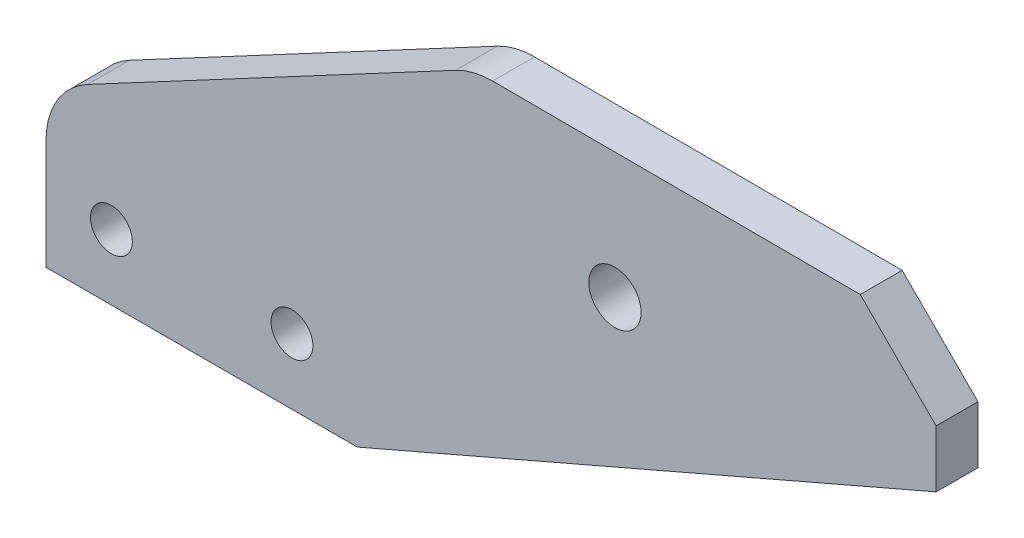
ISO-10303-21;
HEADER;
FILE_DESCRIPTION(('STEP AP214'),'2;1');
FILE_NAME('part.step','',(''),(''),'','','');
FILE_SCHEMA(('AUTOMOTIVE_DESIGN { 1 0 10303 214 1 1 1 1 }'));
ENDSEC;
DATA;
#1=APPLICATION_CONTEXT('core data for automotive mechanical design processes');
#2=APPLICATION_PROTOCOL_DEFINITION('international standard','automotive_design',2000,#1);
#3=PRODUCT_CONTEXT('',#1,'mechanical');
#4=PRODUCT('Part','Part','',(#3));
#5=PRODUCT_RELATED_PRODUCT_CATEGORY('part','',(#4));
#6=PRODUCT_DEFINITION_FORMATION('','',#4);
#7=PRODUCT_DEFINITION_CONTEXT('part definition',#1,'design');
#8=PRODUCT_DEFINITION('design','',#6,#7);
#9=PRODUCT_DEFINITION_SHAPE('','',#8);
#10=(LENGTH_UNIT() NAMED_UNIT(*) SI_UNIT(.MILLI.,.METRE.));
#11=(NAMED_UNIT(*) PLANE_ANGLE_UNIT() SI_UNIT($,.RADIAN.));
#12=(NAMED_UNIT(*) SI_UNIT($,.STERADIAN.) SOLID_ANGLE_UNIT());
#13=UNCERTAINTY_MEASURE_WITH_UNIT(LENGTH_MEASURE(1.E-05),#10,'distance_accuracy_value','');
#14=(GEOMETRIC_REPRESENTATION_CONTEXT(3) GLOBAL_UNCERTAINTY_ASSIGNED_CONTEXT((#13)) GLOBAL_UNIT_ASSIGNED_CONTEXT((#10,
#11,#12)) REPRESENTATION_CONTEXT('',''));
#15=CARTESIAN_POINT('',(0.,0.,0.));
#16=DIRECTION('',(0.,0.,1.));
#17=DIRECTION('',(1.,0.,0.));
#18=AXIS2_PLACEMENT_3D('',#15,#16,#17);
#19=CARTESIAN_POINT('',(43.3416143640874,29.7178697782022,4.064));
#20=DIRECTION('',(0.,0.,-1.));
#21=DIRECTION('',(-1.,0.,0.));
#22=AXIS2_PLACEMENT_3D('',#19,#20,#21);
#23=PLANE('',#22);
#24=DIRECTION('',(1.,0.,0.));
#25=VECTOR('',#24,1.);
#26=CARTESIAN_POINT('',(0.,0.,4.064));
#27=LINE('',#26,#25);
#28=CARTESIAN_POINT('',(0.,0.,4.064));
#29=VERTEX_POINT('',#28);
#30=CARTESIAN_POINT('',(30.226,0.,4.064));
#31=VERTEX_POINT('',#30);
#32=EDGE_CURVE('E159',#29,#31,#27,.T.);
#33=ORIENTED_EDGE('',*,*,#32,.T.);
#34=DIRECTION('',(0.917681868776911,0.397315979691373,0.));
#35=VECTOR('',#34,1.);
#36=CARTESIAN_POINT('',(30.226,0.,4.064));
#37=LINE('',#36,#35);
#38=CARTESIAN_POINT('',(86.4102241419753,24.3253035912332,4.064));
#39=VERTEX_POINT('',#38);
#40=EDGE_CURVE('E102',#31,#39,#37,.T.);
#41=ORIENTED_EDGE('',*,*,#40,.T.);
#42=DIRECTION('',(0.,1.,0.));
#43=VECTOR('',#42,1.);
#44=CARTESIAN_POINT('',(86.4102241419753,24.3253035912332,4.064));
#45=LINE('',#44,#43);
#46=CARTESIAN_POINT('',(86.4102241419753,29.8736818868707,4.064));
#47=VERTEX_POINT('',#46);
#48=EDGE_CURVE('E177',#39,#47,#45,.T.);
#49=ORIENTED_EDGE('',*,*,#48,.T.);
#50=DIRECTION('',(-0.70710678118655,0.707106781186545,0.));
#51=VECTOR('',#50,1.);
#52=CARTESIAN_POINT('',(86.4102241419753,29.8736818868707,4.064));
#53=LINE('',#52,#51);
#54=CARTESIAN_POINT('',(79.0464141226986,37.2374919061473,4.064));
#55=VERTEX_POINT('',#54);
#56=EDGE_CURVE('E194',#47,#55,#53,.T.);
#57=ORIENTED_EDGE('',*,*,#56,.T.);
#58=DIRECTION('',(-0.999996045870571,0.00281215988586562,0.));
#59=VECTOR('',#58,1.);
#60=CARTESIAN_POINT('',(79.0464141226986,37.2374919061473,4.064));
#61=LINE('',#60,#59);
#62=CARTESIAN_POINT('',(43.3630430224177,37.337839647736,4.064));
#63=VERTEX_POINT('',#62);
#64=EDGE_CURVE('E193',#55,#63,#61,.T.);
#65=ORIENTED_EDGE('',*,*,#64,.T.);
#66=CARTESIAN_POINT('',(43.3416143640874,29.7178697782022,4.064));
#67=DIRECTION('',(0.,0.,1.));
#68=DIRECTION('',(-1.,0.,0.));
#69=AXIS2_PLACEMENT_3D('',#66,#67,#68);
#70=CIRCLE('',#69,7.62);
#71=CARTESIAN_POINT('',(39.7559503073095,36.4415156100357,4.064));
#72=VERTEX_POINT('',#71);
#73=EDGE_CURVE('E124',#63,#72,#70,.T.);
#74=ORIENTED_EDGE('',*,*,#73,.T.);
#75=DIRECTION('',(-0.882368219400713,-0.470559587503661,0.));
#76=VECTOR('',#75,1.);
#77=CARTESIAN_POINT('',(39.7559503073095,36.4415156100357,4.064));
#78=LINE('',#77,#76);
#79=CARTESIAN_POINT('',(4.03433594322211,17.3914775980748,4.064));
#80=VERTEX_POINT('',#79);
#81=EDGE_CURVE('E118',#72,#80,#78,.T.);
#82=ORIENTED_EDGE('',*,*,#81,.T.);
#83=CARTESIAN_POINT('',(7.62,10.6678317662414,4.064));
#84=DIRECTION('',(0.,0.,1.));
#85=DIRECTION('',(-1.,0.,0.));
#86=AXIS2_PLACEMENT_3D('',#83,#84,#85);
#87=CIRCLE('',#86,7.61999999999999);
#88=CARTESIAN_POINT('',(0.,10.6678317662414,4.064));
#89=VERTEX_POINT('',#88);
#90=EDGE_CURVE('E122',#80,#89,#87,.T.);
#91=ORIENTED_EDGE('',*,*,#90,.T.);
#92=DIRECTION('',(0.,-1.,0.));
#93=VECTOR('',#92,1.);
#94=CARTESIAN_POINT('',(0.,0.,4.064));
#95=LINE('',#94,#93);
#96=EDGE_CURVE('E56',#89,#29,#95,.T.);
#97=ORIENTED_EDGE('',*,*,#96,.T.);
#98=EDGE_LOOP('',(#33,#41,#49,#57,#65,#74,#82,#91,#97));
#99=FACE_BOUND('',#98,.T.);
#100=CARTESIAN_POINT('',(6.35,6.35,4.064));
#101=DIRECTION('',(0.,0.,1.));
#102=DIRECTION('',(1.,0.,0.));
#103=AXIS2_PLACEMENT_3D('',#100,#101,#102);
#104=CIRCLE('',#103,2.032);
#105=CARTESIAN_POINT('',(8.382,6.35,4.064));
#106=VERTEX_POINT('',#105);
#107=EDGE_CURVE('E146',#106,#106,#104,.T.);
#108=ORIENTED_EDGE('',*,*,#107,.F.);
#109=EDGE_LOOP('',(#108));
#110=FACE_BOUND('',#109,.T.);
#111=CARTESIAN_POINT('',(23.876,6.35,4.064));
#112=DIRECTION('',(0.,0.,1.));
#113=DIRECTION('',(1.,0.,0.));
#114=AXIS2_PLACEMENT_3D('',#111,#112,#113);
#115=CIRCLE('',#114,2.032);
#116=CARTESIAN_POINT('',(25.908,6.35,4.064));
#117=VERTEX_POINT('',#116);
#118=EDGE_CURVE('E204',#117,#117,#115,.T.);
#119=ORIENTED_EDGE('',*,*,#118,.F.);
#120=EDGE_LOOP('',(#119));
#121=FACE_BOUND('',#120,.T.);
#122=CARTESIAN_POINT('',(55.2305931883451,25.0860831376984,4.064));
#123=DIRECTION('',(0.,0.,1.));
#124=DIRECTION('',(1.,0.,0.));
#125=AXIS2_PLACEMENT_3D('',#122,#123,#124);
#126=CIRCLE('',#125,2.54);
#127=CARTESIAN_POINT('',(57.7705931883451,25.0860831376984,4.064));
#128=VERTEX_POINT('',#127);
#129=EDGE_CURVE('E210',#128,#128,#126,.T.);
#130=ORIENTED_EDGE('',*,*,#129,.F.);
#131=EDGE_LOOP('',(#130));
#132=FACE_BOUND('',#131,.T.);
#133=ADVANCED_FACE('F39',(#99,#110,#121,#132),#23,.F.);
#134=CARTESIAN_POINT('',(43.3416143640874,29.7178697782022,0.));
#135=DIRECTION('',(0.,0.,-1.));
#136=DIRECTION('',(-1.,0.,0.));
#137=AXIS2_PLACEMENT_3D('',#134,#135,#136);
#138=PLANE('',#137);
#139=CARTESIAN_POINT('',(23.876,6.35,0.));
#140=DIRECTION('',(0.,0.,1.));
#141=DIRECTION('',(1.,0.,0.));
#142=AXIS2_PLACEMENT_3D('',#139,#140,#141);
#143=CIRCLE('',#142,2.032);
#144=CARTESIAN_POINT('',(25.908,6.35,0.));
#145=VERTEX_POINT('',#144);
#146=EDGE_CURVE('E207',#145,#145,#143,.T.);
#147=ORIENTED_EDGE('',*,*,#146,.T.);
#148=EDGE_LOOP('',(#147));
#149=FACE_BOUND('',#148,.T.);
#150=DIRECTION('',(1.,0.,0.));
#151=VECTOR('',#150,1.);
#152=CARTESIAN_POINT('',(0.,0.,0.));
#153=LINE('',#152,#151);
#154=CARTESIAN_POINT('',(0.,0.,0.));
#155=VERTEX_POINT('',#154);
#156=CARTESIAN_POINT('',(30.226,0.,0.));
#157=VERTEX_POINT('',#156);
#158=EDGE_CURVE('E142',#155,#157,#153,.T.);
#159=ORIENTED_EDGE('',*,*,#158,.F.);
#160=DIRECTION('',(0.,-1.,0.));
#161=VECTOR('',#160,1.);
#162=CARTESIAN_POINT('',(0.,0.,0.));
#163=LINE('',#162,#161);
#164=CARTESIAN_POINT('',(0.,10.6678317662414,0.));
#165=VERTEX_POINT('',#164);
#166=EDGE_CURVE('E94',#165,#155,#163,.T.);
#167=ORIENTED_EDGE('',*,*,#166,.F.);
#168=CARTESIAN_POINT('',(7.62,10.6678317662414,0.));
#169=DIRECTION('',(0.,0.,1.));
#170=DIRECTION('',(-1.,0.,0.));
#171=AXIS2_PLACEMENT_3D('',#168,#169,#170);
#172=CIRCLE('',#171,7.61999999999999);
#173=CARTESIAN_POINT('',(4.03433594322211,17.3914775980748,0.));
#174=VERTEX_POINT('',#173);
#175=EDGE_CURVE('E88',#174,#165,#172,.T.);
#176=ORIENTED_EDGE('',*,*,#175,.F.);
#177=DIRECTION('',(-0.882368219400713,-0.470559587503661,0.));
#178=VECTOR('',#177,1.);
#179=CARTESIAN_POINT('',(39.7559503073095,36.4415156100357,0.));
#180=LINE('',#179,#178);
#181=CARTESIAN_POINT('',(39.7559503073095,36.4415156100357,0.));
#182=VERTEX_POINT('',#181);
#183=EDGE_CURVE('E132',#182,#174,#180,.T.);
#184=ORIENTED_EDGE('',*,*,#183,.F.);
#185=CARTESIAN_POINT('',(43.3416143640874,29.7178697782022,0.));
#186=DIRECTION('',(0.,0.,1.));
#187=DIRECTION('',(-1.,0.,0.));
#188=AXIS2_PLACEMENT_3D('',#185,#186,#187);
#189=CIRCLE('',#188,7.62);
#190=CARTESIAN_POINT('',(43.3630430224177,37.337839647736,0.));
#191=VERTEX_POINT('',#190);
#192=EDGE_CURVE('E154',#191,#182,#189,.T.);
#193=ORIENTED_EDGE('',*,*,#192,.F.);
#194=DIRECTION('',(-0.999996045870571,0.00281215988586562,0.));
#195=VECTOR('',#194,1.);
#196=CARTESIAN_POINT('',(79.0464141226986,37.2374919061473,0.));
#197=LINE('',#196,#195);
#198=CARTESIAN_POINT('',(79.0464141226986,37.2374919061473,0.));
#199=VERTEX_POINT('',#198);
#200=EDGE_CURVE('E152',#199,#191,#197,.T.);
#201=ORIENTED_EDGE('',*,*,#200,.F.);
#202=DIRECTION('',(-0.70710678118655,0.707106781186545,0.));
#203=VECTOR('',#202,1.);
#204=CARTESIAN_POINT('',(86.4102241419753,29.8736818868707,0.));
#205=LINE('',#204,#203);
#206=CARTESIAN_POINT('',(86.4102241419753,29.8736818868707,0.));
#207=VERTEX_POINT('',#206);
#208=EDGE_CURVE('E150',#207,#199,#205,.T.);
#209=ORIENTED_EDGE('',*,*,#208,.F.);
#210=DIRECTION('',(0.,1.,0.));
#211=VECTOR('',#210,1.);
#212=CARTESIAN_POINT('',(86.4102241419753,24.3253035912332,0.));
#213=LINE('',#212,#211);
#214=CARTESIAN_POINT('',(86.4102241419753,24.3253035912332,0.));
#215=VERTEX_POINT('',#214);
#216=EDGE_CURVE('E148',#215,#207,#213,.T.);
#217=ORIENTED_EDGE('',*,*,#216,.F.);
#218=DIRECTION('',(0.917681868776911,0.397315979691373,0.));
#219=VECTOR('',#218,1.);
#220=CARTESIAN_POINT('',(30.226,0.,0.));
#221=LINE('',#220,#219);
#222=EDGE_CURVE('E145',#157,#215,#221,.T.);
#223=ORIENTED_EDGE('',*,*,#222,.F.);
#224=EDGE_LOOP('',(#159,#167,#176,#184,#193,#201,#209,#217,#223));
#225=FACE_BOUND('',#224,.T.);
#226=CARTESIAN_POINT('',(6.35,6.35,0.));
#227=DIRECTION('',(0.,0.,1.));
#228=DIRECTION('',(1.,0.,0.));
#229=AXIS2_PLACEMENT_3D('',#226,#227,#228);
#230=CIRCLE('',#229,2.032);
#231=CARTESIAN_POINT('',(8.382,6.35,0.));
#232=VERTEX_POINT('',#231);
#233=EDGE_CURVE('E201',#232,#232,#230,.T.);
#234=ORIENTED_EDGE('',*,*,#233,.T.);
#235=EDGE_LOOP('',(#234));
#236=FACE_BOUND('',#235,.T.);
#237=CARTESIAN_POINT('',(55.2305931883451,25.0860831376984,0.));
#238=DIRECTION('',(0.,0.,1.));
#239=DIRECTION('',(1.,0.,0.));
#240=AXIS2_PLACEMENT_3D('',#237,#238,#239);
#241=CIRCLE('',#240,2.54);
#242=CARTESIAN_POINT('',(57.7705931883451,25.0860831376984,0.));
#243=VERTEX_POINT('',#242);
#244=EDGE_CURVE('E213',#243,#243,#241,.T.);
#245=ORIENTED_EDGE('',*,*,#244,.T.);
#246=EDGE_LOOP('',(#245));
#247=FACE_BOUND('',#246,.T.);
#248=ADVANCED_FACE('F181',(#149,#225,#236,#247),#138,.T.);
#249=CARTESIAN_POINT('',(0.,0.,4.064));
#250=DIRECTION('',(0.,1.,0.));
#251=DIRECTION('',(0.,0.,1.));
#252=AXIS2_PLACEMENT_3D('',#249,#250,#251);
#253=PLANE('',#252);
#254=ORIENTED_EDGE('',*,*,#158,.T.);
#255=DIRECTION('',(0.,0.,-1.));
#256=VECTOR('',#255,1.);
#257=CARTESIAN_POINT('',(30.226,0.,4.064));
#258=LINE('',#257,#256);
#259=EDGE_CURVE('E11',#31,#157,#258,.T.);
#260=ORIENTED_EDGE('',*,*,#259,.F.);
#261=ORIENTED_EDGE('',*,*,#32,.F.);
#262=DIRECTION('',(0.,0.,-1.));
#263=VECTOR('',#262,1.);
#264=CARTESIAN_POINT('',(0.,0.,4.064));
#265=LINE('',#264,#263);
#266=EDGE_CURVE('E138',#29,#155,#265,.T.);
#267=ORIENTED_EDGE('',*,*,#266,.T.);
#268=EDGE_LOOP('',(#254,#260,#261,#267));
#269=FACE_BOUND('',#268,.T.);
#270=ADVANCED_FACE('F41',(#269),#253,.F.);
#271=CARTESIAN_POINT('',(30.226,0.,4.064));
#272=DIRECTION('',(-0.397315979691373,0.917681868776912,0.));
#273=DIRECTION('',(-0.917681868776912,-0.397315979691373,0.));
#274=AXIS2_PLACEMENT_3D('',#271,#272,#273);
#275=PLANE('',#274);
#276=ORIENTED_EDGE('',*,*,#222,.T.);
#277=DIRECTION('',(0.,0.,-1.));
#278=VECTOR('',#277,1.);
#279=CARTESIAN_POINT('',(86.4102241419753,24.3253035912332,4.064));
#280=LINE('',#279,#278);
#281=EDGE_CURVE('E48',#39,#215,#280,.T.);
#282=ORIENTED_EDGE('',*,*,#281,.F.);
#283=ORIENTED_EDGE('',*,*,#40,.F.);
#284=ORIENTED_EDGE('',*,*,#259,.T.);
#285=EDGE_LOOP('',(#276,#282,#283,#284));
#286=FACE_BOUND('',#285,.T.);
#287=ADVANCED_FACE('F249',(#286),#275,.F.);
#288=CARTESIAN_POINT('',(86.4102241419753,24.3253035912332,4.064));
#289=DIRECTION('',(-1.,0.,0.));
#290=DIRECTION('',(0.,0.,1.));
#291=AXIS2_PLACEMENT_3D('',#288,#289,#290);
#292=PLANE('',#291);
#293=ORIENTED_EDGE('',*,*,#216,.T.);
#294=DIRECTION('',(0.,0.,-1.));
#295=VECTOR('',#294,1.);
#296=CARTESIAN_POINT('',(86.4102241419753,29.8736818868707,4.064));
#297=LINE('',#296,#295);
#298=EDGE_CURVE('E169',#47,#207,#297,.T.);
#299=ORIENTED_EDGE('',*,*,#298,.F.);
#300=ORIENTED_EDGE('',*,*,#48,.F.);
#301=ORIENTED_EDGE('',*,*,#281,.T.);
#302=EDGE_LOOP('',(#293,#299,#300,#301));
#303=FACE_BOUND('',#302,.T.);
#304=ADVANCED_FACE('F175',(#303),#292,.F.);
#305=CARTESIAN_POINT('',(86.4102241419753,29.8736818868707,4.064));
#306=DIRECTION('',(-0.707106781186545,-0.70710678118655,0.));
#307=DIRECTION('',(0.70710678118655,-0.707106781186545,0.));
#308=AXIS2_PLACEMENT_3D('',#305,#306,#307);
#309=PLANE('',#308);
#310=ORIENTED_EDGE('',*,*,#208,.T.);
#311=DIRECTION('',(0.,0.,-1.));
#312=VECTOR('',#311,1.);
#313=CARTESIAN_POINT('',(79.0464141226986,37.2374919061473,4.064));
#314=LINE('',#313,#312);
#315=EDGE_CURVE('E166',#55,#199,#314,.T.);
#316=ORIENTED_EDGE('',*,*,#315,.F.);
#317=ORIENTED_EDGE('',*,*,#56,.F.);
#318=ORIENTED_EDGE('',*,*,#298,.T.);
#319=EDGE_LOOP('',(#310,#316,#317,#318));
#320=FACE_BOUND('',#319,.T.);
#321=ADVANCED_FACE('F187',(#320),#309,.F.);
#322=CARTESIAN_POINT('',(79.0464141226986,37.2374919061473,4.064));
#323=DIRECTION('',(-0.00281215988586562,-0.999996045870571,0.));
#324=DIRECTION('',(0.999996045870571,-0.00281215988586562,0.));
#325=AXIS2_PLACEMENT_3D('',#322,#323,#324);
#326=PLANE('',#325);
#327=ORIENTED_EDGE('',*,*,#200,.T.);
#328=DIRECTION('',(0.,0.,-1.));
#329=VECTOR('',#328,1.);
#330=CARTESIAN_POINT('',(43.3630430224177,37.337839647736,4.064));
#331=LINE('',#330,#329);
#332=EDGE_CURVE('E163',#63,#191,#331,.T.);
#333=ORIENTED_EDGE('',*,*,#332,.F.);
#334=ORIENTED_EDGE('',*,*,#64,.F.);
#335=ORIENTED_EDGE('',*,*,#315,.T.);
#336=EDGE_LOOP('',(#327,#333,#334,#335));
#337=FACE_BOUND('',#336,.T.);
#338=ADVANCED_FACE('F191',(#337),#326,.F.);
#339=CARTESIAN_POINT('',(43.3416143640874,29.7178697782022,4.064));
#340=DIRECTION('',(0.,0.,-1.));
#341=DIRECTION('',(-1.,0.,0.));
#342=AXIS2_PLACEMENT_3D('',#339,#340,#341);
#343=CYLINDRICAL_SURFACE('',#342,7.62);
#344=ORIENTED_EDGE('',*,*,#192,.T.);
#345=DIRECTION('',(0.,0.,-1.));
#346=VECTOR('',#345,1.);
#347=CARTESIAN_POINT('',(39.7559503073095,36.4415156100357,4.064));
#348=LINE('',#347,#346);
#349=EDGE_CURVE('E133',#72,#182,#348,.T.);
#350=ORIENTED_EDGE('',*,*,#349,.F.);
#351=ORIENTED_EDGE('',*,*,#73,.F.);
#352=ORIENTED_EDGE('',*,*,#332,.T.);
#353=EDGE_LOOP('',(#344,#350,#351,#352));
#354=FACE_BOUND('',#353,.T.);
#355=ADVANCED_FACE('F240',(#354),#343,.T.);
#356=CARTESIAN_POINT('',(39.7559503073095,36.4415156100357,4.064));
#357=DIRECTION('',(0.470559587503661,-0.882368219400713,0.));
#358=DIRECTION('',(0.882368219400713,0.470559587503661,0.));
#359=AXIS2_PLACEMENT_3D('',#356,#357,#358);
#360=PLANE('',#359);
#361=ORIENTED_EDGE('',*,*,#183,.T.);
#362=DIRECTION('',(0.,0.,-1.));
#363=VECTOR('',#362,1.);
#364=CARTESIAN_POINT('',(4.03433594322211,17.3914775980748,4.064));
#365=LINE('',#364,#363);
#366=EDGE_CURVE('E129',#80,#174,#365,.T.);
#367=ORIENTED_EDGE('',*,*,#366,.F.);
#368=ORIENTED_EDGE('',*,*,#81,.F.);
#369=ORIENTED_EDGE('',*,*,#349,.T.);
#370=EDGE_LOOP('',(#361,#367,#368,#369));
#371=FACE_BOUND('',#370,.T.);
#372=ADVANCED_FACE('F130',(#371),#360,.F.);
#373=CARTESIAN_POINT('',(7.62,10.6678317662414,4.064));
#374=DIRECTION('',(0.,0.,-1.));
#375=DIRECTION('',(-1.,0.,0.));
#376=AXIS2_PLACEMENT_3D('',#373,#374,#375);
#377=CYLINDRICAL_SURFACE('',#376,7.61999999999999);
#378=ORIENTED_EDGE('',*,*,#175,.T.);
#379=DIRECTION('',(0.,0.,-1.));
#380=VECTOR('',#379,1.);
#381=CARTESIAN_POINT('',(0.,10.6678317662414,4.064));
#382=LINE('',#381,#380);
#383=EDGE_CURVE('E134',#89,#165,#382,.T.);
#384=ORIENTED_EDGE('',*,*,#383,.F.);
#385=ORIENTED_EDGE('',*,*,#90,.F.);
#386=ORIENTED_EDGE('',*,*,#366,.T.);
#387=EDGE_LOOP('',(#378,#384,#385,#386));
#388=FACE_BOUND('',#387,.T.);
#389=ADVANCED_FACE('F136',(#388),#377,.T.);
#390=CARTESIAN_POINT('',(0.,0.,4.064));
#391=DIRECTION('',(1.,0.,0.));
#392=DIRECTION('',(0.,0.,-1.));
#393=AXIS2_PLACEMENT_3D('',#390,#391,#392);
#394=PLANE('',#393);
#395=ORIENTED_EDGE('',*,*,#166,.T.);
#396=ORIENTED_EDGE('',*,*,#266,.F.);
#397=ORIENTED_EDGE('',*,*,#96,.F.);
#398=ORIENTED_EDGE('',*,*,#383,.T.);
#399=EDGE_LOOP('',(#395,#396,#397,#398));
#400=FACE_BOUND('',#399,.T.);
#401=ADVANCED_FACE('F233',(#400),#394,.F.);
#402=CARTESIAN_POINT('',(6.35,6.35,4.064));
#403=DIRECTION('',(0.,0.,-1.));
#404=DIRECTION('',(-1.,0.,0.));
#405=AXIS2_PLACEMENT_3D('',#402,#403,#404);
#406=CYLINDRICAL_SURFACE('',#405,2.032);
#407=ORIENTED_EDGE('',*,*,#107,.T.);
#408=EDGE_LOOP('',(#407));
#409=FACE_BOUND('',#408,.T.);
#410=ORIENTED_EDGE('',*,*,#233,.F.);
#411=EDGE_LOOP('',(#410));
#412=FACE_BOUND('',#411,.T.);
#413=ADVANCED_FACE('F230',(#409,#412),#406,.F.);
#414=CARTESIAN_POINT('',(23.876,6.35,4.064));
#415=DIRECTION('',(0.,0.,-1.));
#416=DIRECTION('',(-1.,0.,0.));
#417=AXIS2_PLACEMENT_3D('',#414,#415,#416);
#418=CYLINDRICAL_SURFACE('',#417,2.032);
#419=ORIENTED_EDGE('',*,*,#118,.T.);
#420=EDGE_LOOP('',(#419));
#421=FACE_BOUND('',#420,.T.);
#422=ORIENTED_EDGE('',*,*,#146,.F.);
#423=EDGE_LOOP('',(#422));
#424=FACE_BOUND('',#423,.T.);
#425=ADVANCED_FACE('F317',(#421,#424),#418,.F.);
#426=CARTESIAN_POINT('',(55.2305931883451,25.0860831376984,4.064));
#427=DIRECTION('',(0.,0.,-1.));
#428=DIRECTION('',(-1.,0.,0.));
#429=AXIS2_PLACEMENT_3D('',#426,#427,#428);
#430=CYLINDRICAL_SURFACE('',#429,2.54);
#431=ORIENTED_EDGE('',*,*,#129,.T.);
#432=EDGE_LOOP('',(#431));
#433=FACE_BOUND('',#432,.T.);
#434=ORIENTED_EDGE('',*,*,#244,.F.);
#435=EDGE_LOOP('',(#434));
#436=FACE_BOUND('',#435,.T.);
#437=ADVANCED_FACE('F219',(#433,#436),#430,.F.);
#438=CLOSED_SHELL('',(#133,#248,#270,#287,#304,#321,#338,#355,#372,#389,#401,#413,#425,#437));
#439=MANIFOLD_SOLID_BREP('B2',#438);
#440=ADVANCED_BREP_SHAPE_REPRESENTATION('',(#18,#439),#14);
#441=SHAPE_DEFINITION_REPRESENTATION(#9,#440);
ENDSEC;
END-ISO-10303-21;
